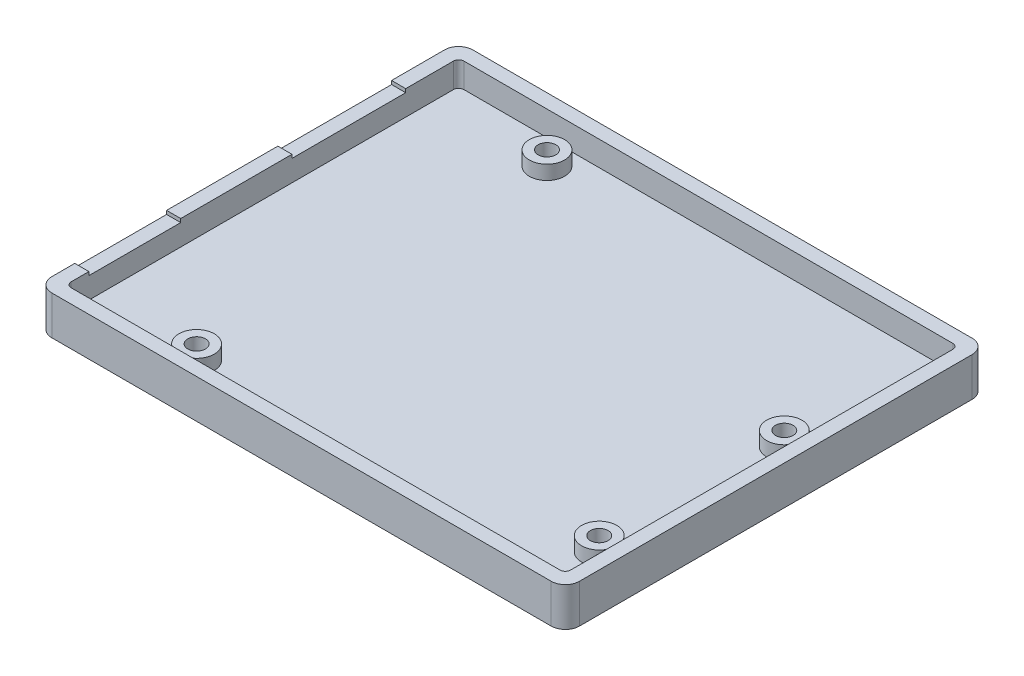
ISO-10303-21;
HEADER;
FILE_DESCRIPTION(('STEP AP214'),'2;1');
FILE_NAME('part.step','',(''),(''),'','','');
FILE_SCHEMA(('AUTOMOTIVE_DESIGN { 1 0 10303 214 1 1 1 1 }'));
ENDSEC;
DATA;
#1=APPLICATION_CONTEXT('core data for automotive mechanical design processes');
#2=APPLICATION_PROTOCOL_DEFINITION('international standard','automotive_design',2000,#1);
#3=PRODUCT_CONTEXT('',#1,'mechanical');
#4=PRODUCT('Part','Part','',(#3));
#5=PRODUCT_RELATED_PRODUCT_CATEGORY('part','',(#4));
#6=PRODUCT_DEFINITION_FORMATION('','',#4);
#7=PRODUCT_DEFINITION_CONTEXT('part definition',#1,'design');
#8=PRODUCT_DEFINITION('design','',#6,#7);
#9=PRODUCT_DEFINITION_SHAPE('','',#8);
#10=(LENGTH_UNIT() NAMED_UNIT(*) SI_UNIT(.MILLI.,.METRE.));
#11=(NAMED_UNIT(*) PLANE_ANGLE_UNIT() SI_UNIT($,.RADIAN.));
#12=(NAMED_UNIT(*) SI_UNIT($,.STERADIAN.) SOLID_ANGLE_UNIT());
#13=UNCERTAINTY_MEASURE_WITH_UNIT(LENGTH_MEASURE(1.E-05),#10,'distance_accuracy_value','');
#14=(GEOMETRIC_REPRESENTATION_CONTEXT(3) GLOBAL_UNCERTAINTY_ASSIGNED_CONTEXT((#13)) GLOBAL_UNIT_ASSIGNED_CONTEXT((#10,
#11,#12)) REPRESENTATION_CONTEXT('',''));
#15=CARTESIAN_POINT('',(0.,0.,0.));
#16=DIRECTION('',(0.,0.,1.));
#17=DIRECTION('',(1.,0.,0.));
#18=AXIS2_PLACEMENT_3D('',#15,#16,#17);
#19=CARTESIAN_POINT('',(0.,1.5,0.));
#20=DIRECTION('',(0.,1.,0.));
#21=DIRECTION('',(0.,0.,1.));
#22=AXIS2_PLACEMENT_3D('',#19,#20,#21);
#23=PLANE('',#22);
#24=DIRECTION('',(-1.,0.,0.));
#25=VECTOR('',#24,1.);
#26=CARTESIAN_POINT('',(-1.00000000000001,1.5,-15.2500000000277));
#27=LINE('',#26,#25);
#28=CARTESIAN_POINT('',(-1.00000000000001,1.5,-15.2500000000277));
#29=VERTEX_POINT('',#28);
#30=CARTESIAN_POINT('',(-3.,1.5,-15.2500000000277));
#31=VERTEX_POINT('',#30);
#32=EDGE_CURVE('E227',#29,#31,#27,.T.);
#33=ORIENTED_EDGE('',*,*,#32,.F.);
#34=DIRECTION('',(0.,0.,1.));
#35=VECTOR('',#34,1.);
#36=CARTESIAN_POINT('',(-0.999999999999993,1.5,0.));
#37=LINE('',#36,#35);
#38=CARTESIAN_POINT('',(-1.00000000000001,1.5,-31.0000000000155));
#39=VERTEX_POINT('',#38);
#40=EDGE_CURVE('E344',#39,#29,#37,.T.);
#41=ORIENTED_EDGE('',*,*,#40,.F.);
#42=DIRECTION('',(1.,0.,0.));
#43=VECTOR('',#42,1.);
#44=CARTESIAN_POINT('',(-3.00000000000001,1.5,-31.0000000000155));
#45=LINE('',#44,#43);
#46=CARTESIAN_POINT('',(-3.,1.5,-31.0000000000155));
#47=VERTEX_POINT('',#46);
#48=EDGE_CURVE('E251',#47,#39,#45,.T.);
#49=ORIENTED_EDGE('',*,*,#48,.F.);
#50=DIRECTION('',(0.,0.,1.));
#51=VECTOR('',#50,1.);
#52=CARTESIAN_POINT('',(-3.,1.5,0.));
#53=LINE('',#52,#51);
#54=EDGE_CURVE('E318',#47,#31,#53,.T.);
#55=ORIENTED_EDGE('',*,*,#54,.T.);
#56=EDGE_LOOP('',(#33,#41,#49,#55));
#57=FACE_BOUND('',#56,.T.);
#58=ADVANCED_FACE('F40',(#57),#23,.T.);
#59=CARTESIAN_POINT('',(71.7,-4.,-56.6));
#60=DIRECTION('',(0.,0.,-1.));
#61=DIRECTION('',(-1.,0.,0.));
#62=AXIS2_PLACEMENT_3D('',#59,#60,#61);
#63=PLANE('',#62);
#64=DIRECTION('',(-1.,0.,0.));
#65=VECTOR('',#64,1.);
#66=CARTESIAN_POINT('',(71.7,-4.,-56.6));
#67=LINE('',#66,#65);
#68=CARTESIAN_POINT('',(69.7,-4.,-56.6));
#69=VERTEX_POINT('',#68);
#70=CARTESIAN_POINT('',(-1.,-4.,-56.6));
#71=VERTEX_POINT('',#70);
#72=EDGE_CURVE('E343',#69,#71,#67,.T.);
#73=ORIENTED_EDGE('',*,*,#72,.T.);
#74=DIRECTION('',(0.,1.,0.));
#75=VECTOR('',#74,1.);
#76=CARTESIAN_POINT('',(-1.,-4.,-56.6));
#77=LINE('',#76,#75);
#78=CARTESIAN_POINT('',(-1.,1.5,-56.6));
#79=VERTEX_POINT('',#78);
#80=EDGE_CURVE('E403',#71,#79,#77,.T.);
#81=ORIENTED_EDGE('',*,*,#80,.T.);
#82=DIRECTION('',(-1.,0.,0.));
#83=VECTOR('',#82,1.);
#84=CARTESIAN_POINT('',(0.,1.5,-56.6));
#85=LINE('',#84,#83);
#86=CARTESIAN_POINT('',(69.7,1.5,-56.6));
#87=VERTEX_POINT('',#86);
#88=EDGE_CURVE('E317',#87,#79,#85,.T.);
#89=ORIENTED_EDGE('',*,*,#88,.F.);
#90=DIRECTION('',(0.,1.,0.));
#91=VECTOR('',#90,1.);
#92=CARTESIAN_POINT('',(69.7,-4.,-56.6));
#93=LINE('',#92,#91);
#94=EDGE_CURVE('E401',#87,#69,#93,.F.);
#95=ORIENTED_EDGE('',*,*,#94,.T.);
#96=EDGE_LOOP('',(#73,#81,#89,#95));
#97=FACE_BOUND('',#96,.T.);
#98=ADVANCED_FACE('F466',(#97),#63,.T.);
#99=CARTESIAN_POINT('',(71.7,-4.,3.));
#100=DIRECTION('',(1.,0.,0.));
#101=DIRECTION('',(0.,0.,-1.));
#102=AXIS2_PLACEMENT_3D('',#99,#100,#101);
#103=PLANE('',#102);
#104=DIRECTION('',(0.,0.,-1.));
#105=VECTOR('',#104,1.);
#106=CARTESIAN_POINT('',(71.7,1.5,0.));
#107=LINE('',#106,#105);
#108=CARTESIAN_POINT('',(71.7,1.5,1.));
#109=VERTEX_POINT('',#108);
#110=CARTESIAN_POINT('',(71.7,1.5,-54.6));
#111=VERTEX_POINT('',#110);
#112=EDGE_CURVE('E321',#109,#111,#107,.T.);
#113=ORIENTED_EDGE('',*,*,#112,.F.);
#114=DIRECTION('',(0.,1.,0.));
#115=VECTOR('',#114,1.);
#116=CARTESIAN_POINT('',(71.7,-4.,1.));
#117=LINE('',#116,#115);
#118=CARTESIAN_POINT('',(71.7,-4.,1.));
#119=VERTEX_POINT('',#118);
#120=EDGE_CURVE('E12',#109,#119,#117,.F.);
#121=ORIENTED_EDGE('',*,*,#120,.T.);
#122=DIRECTION('',(0.,0.,-1.));
#123=VECTOR('',#122,1.);
#124=CARTESIAN_POINT('',(71.7,-4.,3.));
#125=LINE('',#124,#123);
#126=CARTESIAN_POINT('',(71.7,-4.,-54.6));
#127=VERTEX_POINT('',#126);
#128=EDGE_CURVE('E353',#119,#127,#125,.T.);
#129=ORIENTED_EDGE('',*,*,#128,.T.);
#130=DIRECTION('',(0.,1.,0.));
#131=VECTOR('',#130,1.);
#132=CARTESIAN_POINT('',(71.7,-4.,-54.6));
#133=LINE('',#132,#131);
#134=EDGE_CURVE('E48',#127,#111,#133,.T.);
#135=ORIENTED_EDGE('',*,*,#134,.T.);
#136=EDGE_LOOP('',(#113,#121,#129,#135));
#137=FACE_BOUND('',#136,.T.);
#138=ADVANCED_FACE('F434',(#137),#103,.T.);
#139=CARTESIAN_POINT('',(-3.,-4.,3.));
#140=DIRECTION('',(0.,0.,1.));
#141=DIRECTION('',(1.,0.,0.));
#142=AXIS2_PLACEMENT_3D('',#139,#140,#141);
#143=PLANE('',#142);
#144=DIRECTION('',(1.,0.,0.));
#145=VECTOR('',#144,1.);
#146=CARTESIAN_POINT('',(-3.,-4.,3.));
#147=LINE('',#146,#145);
#148=CARTESIAN_POINT('',(-1.,-4.,3.));
#149=VERTEX_POINT('',#148);
#150=CARTESIAN_POINT('',(69.7,-4.,3.));
#151=VERTEX_POINT('',#150);
#152=EDGE_CURVE('E350',#149,#151,#147,.T.);
#153=ORIENTED_EDGE('',*,*,#152,.T.);
#154=DIRECTION('',(0.,1.,0.));
#155=VECTOR('',#154,1.);
#156=CARTESIAN_POINT('',(69.7,-4.,3.));
#157=LINE('',#156,#155);
#158=CARTESIAN_POINT('',(69.7,1.5,3.));
#159=VERTEX_POINT('',#158);
#160=EDGE_CURVE('E428',#151,#159,#157,.T.);
#161=ORIENTED_EDGE('',*,*,#160,.T.);
#162=DIRECTION('',(1.,0.,0.));
#163=VECTOR('',#162,1.);
#164=CARTESIAN_POINT('',(0.,1.5,3.));
#165=LINE('',#164,#163);
#166=CARTESIAN_POINT('',(-1.,1.5,3.));
#167=VERTEX_POINT('',#166);
#168=EDGE_CURVE('E324',#167,#159,#165,.T.);
#169=ORIENTED_EDGE('',*,*,#168,.F.);
#170=DIRECTION('',(0.,1.,0.));
#171=VECTOR('',#170,1.);
#172=CARTESIAN_POINT('',(-1.,-4.,3.));
#173=LINE('',#172,#171);
#174=EDGE_CURVE('E426',#167,#149,#173,.F.);
#175=ORIENTED_EDGE('',*,*,#174,.T.);
#176=EDGE_LOOP('',(#153,#161,#169,#175));
#177=FACE_BOUND('',#176,.T.);
#178=ADVANCED_FACE('F448',(#177),#143,.T.);
#179=CARTESIAN_POINT('',(-3.,-4.,-56.6));
#180=DIRECTION('',(-1.,0.,0.));
#181=DIRECTION('',(0.,0.,1.));
#182=AXIS2_PLACEMENT_3D('',#179,#180,#181);
#183=PLANE('',#182);
#184=DIRECTION('',(0.,1.,0.));
#185=VECTOR('',#184,1.);
#186=CARTESIAN_POINT('',(-3.,1.,-15.2500000000277));
#187=LINE('',#186,#185);
#188=CARTESIAN_POINT('',(-3.,1.,-15.2500000000277));
#189=VERTEX_POINT('',#188);
#190=EDGE_CURVE('E268',#189,#31,#187,.T.);
#191=ORIENTED_EDGE('',*,*,#190,.T.);
#192=ORIENTED_EDGE('',*,*,#54,.F.);
#193=DIRECTION('',(0.,1.,0.));
#194=VECTOR('',#193,1.);
#195=CARTESIAN_POINT('',(-3.00000000000001,1.,-31.0000000000155));
#196=LINE('',#195,#194);
#197=CARTESIAN_POINT('',(-3.00000000000001,1.,-31.0000000000155));
#198=VERTEX_POINT('',#197);
#199=EDGE_CURVE('E63',#198,#47,#196,.T.);
#200=ORIENTED_EDGE('',*,*,#199,.F.);
#201=DIRECTION('',(0.,0.,1.));
#202=VECTOR('',#201,1.);
#203=CARTESIAN_POINT('',(-3.00000000000001,1.,-47.0999999999908));
#204=LINE('',#203,#202);
#205=CARTESIAN_POINT('',(-3.00000000000001,1.,-47.0999999999908));
#206=VERTEX_POINT('',#205);
#207=EDGE_CURVE('E239',#206,#198,#204,.T.);
#208=ORIENTED_EDGE('',*,*,#207,.F.);
#209=DIRECTION('',(0.,1.,0.));
#210=VECTOR('',#209,1.);
#211=CARTESIAN_POINT('',(-3.00000000000001,1.,-47.0999999999908));
#212=LINE('',#211,#210);
#213=CARTESIAN_POINT('',(-3.00000000000001,1.5,-47.0999999999908));
#214=VERTEX_POINT('',#213);
#215=EDGE_CURVE('E254',#206,#214,#212,.T.);
#216=ORIENTED_EDGE('',*,*,#215,.T.);
#217=CARTESIAN_POINT('',(-3.,1.5,-54.6));
#218=VERTEX_POINT('',#217);
#219=EDGE_CURVE('E314',#218,#214,#53,.T.);
#220=ORIENTED_EDGE('',*,*,#219,.F.);
#221=DIRECTION('',(0.,1.,0.));
#222=VECTOR('',#221,1.);
#223=CARTESIAN_POINT('',(-3.,-4.,-54.6));
#224=LINE('',#223,#222);
#225=CARTESIAN_POINT('',(-3.,-4.,-54.6));
#226=VERTEX_POINT('',#225);
#227=EDGE_CURVE('E416',#218,#226,#224,.F.);
#228=ORIENTED_EDGE('',*,*,#227,.T.);
#229=DIRECTION('',(0.,0.,1.));
#230=VECTOR('',#229,1.);
#231=CARTESIAN_POINT('',(-3.,-4.,-56.6));
#232=LINE('',#231,#230);
#233=CARTESIAN_POINT('',(-3.,-4.,1.));
#234=VERTEX_POINT('',#233);
#235=EDGE_CURVE('E347',#226,#234,#232,.T.);
#236=ORIENTED_EDGE('',*,*,#235,.T.);
#237=DIRECTION('',(0.,1.,0.));
#238=VECTOR('',#237,1.);
#239=CARTESIAN_POINT('',(-3.,-4.,1.));
#240=LINE('',#239,#238);
#241=CARTESIAN_POINT('',(-3.,1.5,1.));
#242=VERTEX_POINT('',#241);
#243=EDGE_CURVE('E414',#234,#242,#240,.T.);
#244=ORIENTED_EDGE('',*,*,#243,.T.);
#245=CARTESIAN_POINT('',(-3.,1.5,-2.25000000001319));
#246=VERTEX_POINT('',#245);
#247=EDGE_CURVE('E232',#246,#242,#53,.T.);
#248=ORIENTED_EDGE('',*,*,#247,.F.);
#249=DIRECTION('',(0.,1.,0.));
#250=VECTOR('',#249,1.);
#251=CARTESIAN_POINT('',(-3.,1.,-2.25000000001319));
#252=LINE('',#251,#250);
#253=CARTESIAN_POINT('',(-3.,1.,-2.25000000001319));
#254=VERTEX_POINT('',#253);
#255=EDGE_CURVE('E55',#254,#246,#252,.T.);
#256=ORIENTED_EDGE('',*,*,#255,.F.);
#257=DIRECTION('',(0.,0.,1.));
#258=VECTOR('',#257,1.);
#259=CARTESIAN_POINT('',(-3.,1.,-15.2500000000277));
#260=LINE('',#259,#258);
#261=EDGE_CURVE('E218',#189,#254,#260,.T.);
#262=ORIENTED_EDGE('',*,*,#261,.F.);
#263=EDGE_LOOP('',(#191,#192,#200,#208,#216,#220,#228,#236,#244,#248,#256,#262));
#264=FACE_BOUND('',#263,.T.);
#265=ADVANCED_FACE('F230',(#264),#183,.T.);
#266=CARTESIAN_POINT('',(0.,-4.,0.));
#267=DIRECTION('',(0.,1.,0.));
#268=DIRECTION('',(0.,0.,1.));
#269=AXIS2_PLACEMENT_3D('',#266,#267,#268);
#270=PLANE('',#269);
#271=ORIENTED_EDGE('',*,*,#235,.F.);
#272=CARTESIAN_POINT('',(-1.,-4.,-54.6));
#273=DIRECTION('',(0.,1.,0.));
#274=DIRECTION('',(0.,0.,1.));
#275=AXIS2_PLACEMENT_3D('',#272,#273,#274);
#276=CIRCLE('',#275,2.);
#277=EDGE_CURVE('E424',#226,#71,#276,.F.);
#278=ORIENTED_EDGE('',*,*,#277,.T.);
#279=ORIENTED_EDGE('',*,*,#72,.F.);
#280=CARTESIAN_POINT('',(69.7,-4.,-54.6));
#281=DIRECTION('',(0.,1.,0.));
#282=DIRECTION('',(0.,0.,1.));
#283=AXIS2_PLACEMENT_3D('',#280,#281,#282);
#284=CIRCLE('',#283,2.);
#285=EDGE_CURVE('E420',#69,#127,#284,.F.);
#286=ORIENTED_EDGE('',*,*,#285,.T.);
#287=ORIENTED_EDGE('',*,*,#128,.F.);
#288=CARTESIAN_POINT('',(69.7,-4.,1.));
#289=DIRECTION('',(0.,1.,0.));
#290=DIRECTION('',(0.,0.,1.));
#291=AXIS2_PLACEMENT_3D('',#288,#289,#290);
#292=CIRCLE('',#291,2.);
#293=EDGE_CURVE('E422',#119,#151,#292,.F.);
#294=ORIENTED_EDGE('',*,*,#293,.T.);
#295=ORIENTED_EDGE('',*,*,#152,.F.);
#296=CARTESIAN_POINT('',(-1.,-4.,1.));
#297=DIRECTION('',(0.,1.,0.));
#298=DIRECTION('',(0.,0.,1.));
#299=AXIS2_PLACEMENT_3D('',#296,#297,#298);
#300=CIRCLE('',#299,2.);
#301=EDGE_CURVE('E418',#149,#234,#300,.F.);
#302=ORIENTED_EDGE('',*,*,#301,.T.);
#303=EDGE_LOOP('',(#271,#278,#279,#286,#287,#294,#295,#302));
#304=FACE_BOUND('',#303,.T.);
#305=ADVANCED_FACE('F454',(#304),#270,.F.);
#306=CARTESIAN_POINT('',(-0.999999999999993,98.5628065724317,0.));
#307=DIRECTION('',(1.,0.,0.));
#308=DIRECTION('',(0.,0.,-1.));
#309=AXIS2_PLACEMENT_3D('',#306,#307,#308);
#310=PLANE('',#309);
#311=DIRECTION('',(0.,1.,0.));
#312=VECTOR('',#311,1.);
#313=CARTESIAN_POINT('',(-1.00000000000001,1.,-15.2500000000277));
#314=LINE('',#313,#312);
#315=CARTESIAN_POINT('',(-1.00000000000001,1.,-15.2500000000277));
#316=VERTEX_POINT('',#315);
#317=EDGE_CURVE('E234',#316,#29,#314,.T.);
#318=ORIENTED_EDGE('',*,*,#317,.F.);
#319=DIRECTION('',(0.,0.,-1.));
#320=VECTOR('',#319,1.);
#321=CARTESIAN_POINT('',(-1.00000000000001,1.,-2.25000000001319));
#322=LINE('',#321,#320);
#323=CARTESIAN_POINT('',(-1.00000000000001,1.,-2.25000000001319));
#324=VERTEX_POINT('',#323);
#325=EDGE_CURVE('E217',#324,#316,#322,.T.);
#326=ORIENTED_EDGE('',*,*,#325,.F.);
#327=DIRECTION('',(0.,1.,0.));
#328=VECTOR('',#327,1.);
#329=CARTESIAN_POINT('',(-1.00000000000001,1.,-2.25000000001319));
#330=LINE('',#329,#328);
#331=CARTESIAN_POINT('',(-1.00000000000001,1.5,-2.25000000001319));
#332=VERTEX_POINT('',#331);
#333=EDGE_CURVE('E214',#324,#332,#330,.T.);
#334=ORIENTED_EDGE('',*,*,#333,.T.);
#335=CARTESIAN_POINT('',(-0.999999999999993,1.5,0.25));
#336=VERTEX_POINT('',#335);
#337=EDGE_CURVE('E339',#332,#336,#37,.T.);
#338=ORIENTED_EDGE('',*,*,#337,.T.);
#339=DIRECTION('',(0.,-1.,0.));
#340=VECTOR('',#339,1.);
#341=CARTESIAN_POINT('',(-0.999999999999993,-2.,0.25));
#342=LINE('',#341,#340);
#343=CARTESIAN_POINT('',(-0.999999999999993,-2.,0.25));
#344=VERTEX_POINT('',#343);
#345=EDGE_CURVE('E377',#336,#344,#342,.T.);
#346=ORIENTED_EDGE('',*,*,#345,.T.);
#347=DIRECTION('',(0.,0.,1.));
#348=VECTOR('',#347,1.);
#349=CARTESIAN_POINT('',(-0.999999999999993,-2.,0.));
#350=LINE('',#349,#348);
#351=CARTESIAN_POINT('',(-1.,-2.,-53.85));
#352=VERTEX_POINT('',#351);
#353=EDGE_CURVE('E336',#352,#344,#350,.T.);
#354=ORIENTED_EDGE('',*,*,#353,.F.);
#355=DIRECTION('',(0.,-1.,0.));
#356=VECTOR('',#355,1.);
#357=CARTESIAN_POINT('',(-1.,1.5,-53.85));
#358=LINE('',#357,#356);
#359=CARTESIAN_POINT('',(-1.,1.5,-53.85));
#360=VERTEX_POINT('',#359);
#361=EDGE_CURVE('E380',#352,#360,#358,.F.);
#362=ORIENTED_EDGE('',*,*,#361,.T.);
#363=CARTESIAN_POINT('',(-1.00000000000001,1.5,-47.0999999999908));
#364=VERTEX_POINT('',#363);
#365=EDGE_CURVE('E340',#360,#364,#37,.T.);
#366=ORIENTED_EDGE('',*,*,#365,.T.);
#367=DIRECTION('',(0.,1.,0.));
#368=VECTOR('',#367,1.);
#369=CARTESIAN_POINT('',(-1.00000000000001,1.,-47.0999999999908));
#370=LINE('',#369,#368);
#371=CARTESIAN_POINT('',(-1.00000000000001,1.,-47.0999999999908));
#372=VERTEX_POINT('',#371);
#373=EDGE_CURVE('E258',#372,#364,#370,.T.);
#374=ORIENTED_EDGE('',*,*,#373,.F.);
#375=DIRECTION('',(0.,0.,-1.));
#376=VECTOR('',#375,1.);
#377=CARTESIAN_POINT('',(-1.00000000000001,1.,-31.0000000000155));
#378=LINE('',#377,#376);
#379=CARTESIAN_POINT('',(-1.00000000000001,1.,-31.0000000000155));
#380=VERTEX_POINT('',#379);
#381=EDGE_CURVE('E246',#380,#372,#378,.T.);
#382=ORIENTED_EDGE('',*,*,#381,.F.);
#383=DIRECTION('',(0.,1.,0.));
#384=VECTOR('',#383,1.);
#385=CARTESIAN_POINT('',(-1.00000000000001,1.,-31.0000000000155));
#386=LINE('',#385,#384);
#387=EDGE_CURVE('E260',#380,#39,#386,.T.);
#388=ORIENTED_EDGE('',*,*,#387,.T.);
#389=ORIENTED_EDGE('',*,*,#40,.T.);
#390=EDGE_LOOP('',(#318,#326,#334,#338,#346,#354,#362,#366,#374,#382,#388,#389));
#391=FACE_BOUND('',#390,.T.);
#392=ADVANCED_FACE('F479',(#391),#310,.T.);
#393=CARTESIAN_POINT('',(0.,98.5628065724317,-54.6));
#394=DIRECTION('',(0.,0.,1.));
#395=DIRECTION('',(1.,0.,0.));
#396=AXIS2_PLACEMENT_3D('',#393,#394,#395);
#397=PLANE('',#396);
#398=DIRECTION('',(-1.,0.,0.));
#399=VECTOR('',#398,1.);
#400=CARTESIAN_POINT('',(0.,1.5,-54.6));
#401=LINE('',#400,#399);
#402=CARTESIAN_POINT('',(68.95,1.5,-54.6));
#403=VERTEX_POINT('',#402);
#404=CARTESIAN_POINT('',(-0.25,1.5,-54.6));
#405=VERTEX_POINT('',#404);
#406=EDGE_CURVE('E305',#403,#405,#401,.T.);
#407=ORIENTED_EDGE('',*,*,#406,.T.);
#408=DIRECTION('',(0.,-1.,0.));
#409=VECTOR('',#408,1.);
#410=CARTESIAN_POINT('',(-0.25,-2.,-54.6));
#411=LINE('',#410,#409);
#412=CARTESIAN_POINT('',(-0.25,-2.,-54.6));
#413=VERTEX_POINT('',#412);
#414=EDGE_CURVE('E366',#405,#413,#411,.T.);
#415=ORIENTED_EDGE('',*,*,#414,.T.);
#416=DIRECTION('',(-1.,0.,0.));
#417=VECTOR('',#416,1.);
#418=CARTESIAN_POINT('',(0.,-2.,-54.6));
#419=LINE('',#418,#417);
#420=CARTESIAN_POINT('',(68.95,-2.,-54.6));
#421=VERTEX_POINT('',#420);
#422=EDGE_CURVE('E333',#421,#413,#419,.T.);
#423=ORIENTED_EDGE('',*,*,#422,.F.);
#424=DIRECTION('',(0.,-1.,0.));
#425=VECTOR('',#424,1.);
#426=CARTESIAN_POINT('',(68.95,1.5,-54.6));
#427=LINE('',#426,#425);
#428=EDGE_CURVE('E356',#421,#403,#427,.F.);
#429=ORIENTED_EDGE('',*,*,#428,.T.);
#430=EDGE_LOOP('',(#407,#415,#423,#429));
#431=FACE_BOUND('',#430,.T.);
#432=ADVANCED_FACE('F491',(#431),#397,.T.);
#433=CARTESIAN_POINT('',(69.7,98.5628065724317,0.));
#434=DIRECTION('',(-1.,0.,0.));
#435=DIRECTION('',(0.,0.,1.));
#436=AXIS2_PLACEMENT_3D('',#433,#434,#435);
#437=PLANE('',#436);
#438=DIRECTION('',(0.,0.,-1.));
#439=VECTOR('',#438,1.);
#440=CARTESIAN_POINT('',(69.7,1.5,0.));
#441=LINE('',#440,#439);
#442=CARTESIAN_POINT('',(69.7,1.5,0.249999999999996));
#443=VERTEX_POINT('',#442);
#444=CARTESIAN_POINT('',(69.7,1.5,-53.85));
#445=VERTEX_POINT('',#444);
#446=EDGE_CURVE('E308',#443,#445,#441,.T.);
#447=ORIENTED_EDGE('',*,*,#446,.T.);
#448=DIRECTION('',(0.,-1.,0.));
#449=VECTOR('',#448,1.);
#450=CARTESIAN_POINT('',(69.7,-2.,-53.85));
#451=LINE('',#450,#449);
#452=CARTESIAN_POINT('',(69.7,-2.,-53.85));
#453=VERTEX_POINT('',#452);
#454=EDGE_CURVE('E384',#445,#453,#451,.T.);
#455=ORIENTED_EDGE('',*,*,#454,.T.);
#456=DIRECTION('',(0.,0.,-1.));
#457=VECTOR('',#456,1.);
#458=CARTESIAN_POINT('',(69.7,-2.,0.));
#459=LINE('',#458,#457);
#460=CARTESIAN_POINT('',(69.7,-2.,0.249999999999996));
#461=VERTEX_POINT('',#460);
#462=EDGE_CURVE('E330',#461,#453,#459,.T.);
#463=ORIENTED_EDGE('',*,*,#462,.F.);
#464=DIRECTION('',(0.,-1.,0.));
#465=VECTOR('',#464,1.);
#466=CARTESIAN_POINT('',(69.7,1.5,0.249999999999996));
#467=LINE('',#466,#465);
#468=EDGE_CURVE('E382',#461,#443,#467,.F.);
#469=ORIENTED_EDGE('',*,*,#468,.T.);
#470=EDGE_LOOP('',(#447,#455,#463,#469));
#471=FACE_BOUND('',#470,.T.);
#472=ADVANCED_FACE('F502',(#471),#437,.T.);
#473=CARTESIAN_POINT('',(0.,98.5628065724317,1.));
#474=DIRECTION('',(0.,0.,-1.));
#475=DIRECTION('',(-1.,0.,0.));
#476=AXIS2_PLACEMENT_3D('',#473,#474,#475);
#477=PLANE('',#476);
#478=DIRECTION('',(1.,0.,0.));
#479=VECTOR('',#478,1.);
#480=CARTESIAN_POINT('',(0.,-2.,1.));
#481=LINE('',#480,#479);
#482=CARTESIAN_POINT('',(-0.249999999999993,-2.,1.));
#483=VERTEX_POINT('',#482);
#484=CARTESIAN_POINT('',(68.95,-2.,0.999999999999995));
#485=VERTEX_POINT('',#484);
#486=EDGE_CURVE('E327',#483,#485,#481,.T.);
#487=ORIENTED_EDGE('',*,*,#486,.F.);
#488=DIRECTION('',(0.,-1.,0.));
#489=VECTOR('',#488,1.);
#490=CARTESIAN_POINT('',(-0.249999999999993,1.5,1.));
#491=LINE('',#490,#489);
#492=CARTESIAN_POINT('',(-0.249999999999993,1.5,1.));
#493=VERTEX_POINT('',#492);
#494=EDGE_CURVE('E390',#483,#493,#491,.F.);
#495=ORIENTED_EDGE('',*,*,#494,.T.);
#496=DIRECTION('',(1.,0.,0.));
#497=VECTOR('',#496,1.);
#498=CARTESIAN_POINT('',(0.,1.5,1.));
#499=LINE('',#498,#497);
#500=CARTESIAN_POINT('',(68.95,1.5,0.999999999999995));
#501=VERTEX_POINT('',#500);
#502=EDGE_CURVE('E311',#493,#501,#499,.T.);
#503=ORIENTED_EDGE('',*,*,#502,.T.);
#504=DIRECTION('',(0.,-1.,0.));
#505=VECTOR('',#504,1.);
#506=CARTESIAN_POINT('',(68.95,-2.,0.999999999999996));
#507=LINE('',#506,#505);
#508=EDGE_CURVE('E387',#501,#485,#507,.T.);
#509=ORIENTED_EDGE('',*,*,#508,.T.);
#510=EDGE_LOOP('',(#487,#495,#503,#509));
#511=FACE_BOUND('',#510,.T.);
#512=ADVANCED_FACE('F512',(#511),#477,.T.);
#513=DIRECTION('',(1.,0.,0.));
#514=VECTOR('',#513,1.);
#515=CARTESIAN_POINT('',(-3.,1.5,-2.25000000001319));
#516=LINE('',#515,#514);
#517=EDGE_CURVE('E257',#246,#332,#516,.T.);
#518=ORIENTED_EDGE('',*,*,#517,.F.);
#519=ORIENTED_EDGE('',*,*,#247,.T.);
#520=CARTESIAN_POINT('',(-1.,1.5,1.));
#521=DIRECTION('',(0.,1.,0.));
#522=DIRECTION('',(0.,0.,1.));
#523=AXIS2_PLACEMENT_3D('',#520,#521,#522);
#524=CIRCLE('',#523,2.);
#525=EDGE_CURVE('E406',#242,#167,#524,.T.);
#526=ORIENTED_EDGE('',*,*,#525,.T.);
#527=ORIENTED_EDGE('',*,*,#168,.T.);
#528=CARTESIAN_POINT('',(69.7,1.5,1.));
#529=DIRECTION('',(0.,1.,0.));
#530=DIRECTION('',(0.,0.,1.));
#531=AXIS2_PLACEMENT_3D('',#528,#529,#530);
#532=CIRCLE('',#531,2.);
#533=EDGE_CURVE('E410',#159,#109,#532,.T.);
#534=ORIENTED_EDGE('',*,*,#533,.T.);
#535=ORIENTED_EDGE('',*,*,#112,.T.);
#536=CARTESIAN_POINT('',(69.7,1.5,-54.6));
#537=DIRECTION('',(0.,1.,0.));
#538=DIRECTION('',(0.,0.,1.));
#539=AXIS2_PLACEMENT_3D('',#536,#537,#538);
#540=CIRCLE('',#539,2.);
#541=EDGE_CURVE('E408',#111,#87,#540,.T.);
#542=ORIENTED_EDGE('',*,*,#541,.T.);
#543=ORIENTED_EDGE('',*,*,#88,.T.);
#544=CARTESIAN_POINT('',(-1.,1.5,-54.6));
#545=DIRECTION('',(0.,1.,0.));
#546=DIRECTION('',(0.,0.,1.));
#547=AXIS2_PLACEMENT_3D('',#544,#545,#546);
#548=CIRCLE('',#547,2.);
#549=EDGE_CURVE('E412',#79,#218,#548,.T.);
#550=ORIENTED_EDGE('',*,*,#549,.T.);
#551=ORIENTED_EDGE('',*,*,#219,.T.);
#552=DIRECTION('',(-1.,0.,0.));
#553=VECTOR('',#552,1.);
#554=CARTESIAN_POINT('',(-1.00000000000001,1.5,-47.0999999999908));
#555=LINE('',#554,#553);
#556=EDGE_CURVE('E243',#364,#214,#555,.T.);
#557=ORIENTED_EDGE('',*,*,#556,.F.);
#558=ORIENTED_EDGE('',*,*,#365,.F.);
#559=CARTESIAN_POINT('',(-0.25,1.5,-53.85));
#560=DIRECTION('',(0.,1.,0.));
#561=DIRECTION('',(0.,0.,1.));
#562=AXIS2_PLACEMENT_3D('',#559,#560,#561);
#563=CIRCLE('',#562,0.75);
#564=EDGE_CURVE('E392',#360,#405,#563,.F.);
#565=ORIENTED_EDGE('',*,*,#564,.T.);
#566=ORIENTED_EDGE('',*,*,#406,.F.);
#567=CARTESIAN_POINT('',(68.95,1.5,-53.85));
#568=DIRECTION('',(0.,1.,0.));
#569=DIRECTION('',(0.,0.,1.));
#570=AXIS2_PLACEMENT_3D('',#567,#568,#569);
#571=CIRCLE('',#570,0.75);
#572=EDGE_CURVE('E394',#403,#445,#571,.F.);
#573=ORIENTED_EDGE('',*,*,#572,.T.);
#574=ORIENTED_EDGE('',*,*,#446,.F.);
#575=CARTESIAN_POINT('',(68.95,1.5,0.249999999999996));
#576=DIRECTION('',(0.,1.,0.));
#577=DIRECTION('',(0.,0.,1.));
#578=AXIS2_PLACEMENT_3D('',#575,#576,#577);
#579=CIRCLE('',#578,0.75);
#580=EDGE_CURVE('E399',#443,#501,#579,.F.);
#581=ORIENTED_EDGE('',*,*,#580,.T.);
#582=ORIENTED_EDGE('',*,*,#502,.F.);
#583=CARTESIAN_POINT('',(-0.249999999999993,1.5,0.25));
#584=DIRECTION('',(0.,1.,0.));
#585=DIRECTION('',(0.,0.,1.));
#586=AXIS2_PLACEMENT_3D('',#583,#584,#585);
#587=CIRCLE('',#586,0.75);
#588=EDGE_CURVE('E396',#493,#336,#587,.F.);
#589=ORIENTED_EDGE('',*,*,#588,.T.);
#590=ORIENTED_EDGE('',*,*,#337,.F.);
#591=EDGE_LOOP('',(#518,#519,#526,#527,#534,#535,#542,#543,#550,#551,#557,#558,#565,#566,#573,
#574,#581,#582,#589,#590));
#592=FACE_BOUND('',#591,.T.);
#593=ADVANCED_FACE('F440',(#592),#23,.T.);
#594=CARTESIAN_POINT('',(0.,-2.,0.));
#595=DIRECTION('',(0.,1.,0.));
#596=DIRECTION('',(0.,0.,1.));
#597=AXIS2_PLACEMENT_3D('',#594,#595,#596);
#598=PLANE('',#597);
#599=CARTESIAN_POINT('',(66.,-2.,-7.5));
#600=DIRECTION('',(0.,1.,0.));
#601=DIRECTION('',(0.,0.,1.));
#602=AXIS2_PLACEMENT_3D('',#599,#600,#601);
#603=CIRCLE('',#602,2.5);
#604=CARTESIAN_POINT('',(66.,-2.,-5.));
#605=VERTEX_POINT('',#604);
#606=EDGE_CURVE('E292',#605,#605,#603,.F.);
#607=ORIENTED_EDGE('',*,*,#606,.T.);
#608=EDGE_LOOP('',(#607));
#609=FACE_BOUND('',#608,.T.);
#610=CARTESIAN_POINT('',(66.2,-2.,-33.5));
#611=DIRECTION('',(0.,1.,0.));
#612=DIRECTION('',(0.,0.,1.));
#613=AXIS2_PLACEMENT_3D('',#610,#611,#612);
#614=CIRCLE('',#613,2.50000000000001);
#615=CARTESIAN_POINT('',(66.2,-2.,-31.));
#616=VERTEX_POINT('',#615);
#617=EDGE_CURVE('E296',#616,#616,#614,.F.);
#618=ORIENTED_EDGE('',*,*,#617,.T.);
#619=EDGE_LOOP('',(#618));
#620=FACE_BOUND('',#619,.T.);
#621=CARTESIAN_POINT('',(15.,-2.,-51.1));
#622=DIRECTION('',(0.,1.,0.));
#623=DIRECTION('',(0.,0.,1.));
#624=AXIS2_PLACEMENT_3D('',#621,#622,#623);
#625=CIRCLE('',#624,2.5);
#626=CARTESIAN_POINT('',(15.,-2.,-48.6));
#627=VERTEX_POINT('',#626);
#628=EDGE_CURVE('E300',#627,#627,#625,.F.);
#629=ORIENTED_EDGE('',*,*,#628,.T.);
#630=EDGE_LOOP('',(#629));
#631=FACE_BOUND('',#630,.T.);
#632=CARTESIAN_POINT('',(14.,-2.,-2.5));
#633=DIRECTION('',(0.,1.,0.));
#634=DIRECTION('',(0.,0.,1.));
#635=AXIS2_PLACEMENT_3D('',#632,#633,#634);
#636=CIRCLE('',#635,2.5);
#637=CARTESIAN_POINT('',(14.,-2.,0.));
#638=VERTEX_POINT('',#637);
#639=EDGE_CURVE('E304',#638,#638,#636,.F.);
#640=ORIENTED_EDGE('',*,*,#639,.T.);
#641=EDGE_LOOP('',(#640));
#642=FACE_BOUND('',#641,.T.);
#643=ORIENTED_EDGE('',*,*,#422,.T.);
#644=CARTESIAN_POINT('',(-0.25,-2.,-53.85));
#645=DIRECTION('',(0.,1.,0.));
#646=DIRECTION('',(0.,0.,1.));
#647=AXIS2_PLACEMENT_3D('',#644,#645,#646);
#648=CIRCLE('',#647,0.75);
#649=EDGE_CURVE('E375',#413,#352,#648,.T.);
#650=ORIENTED_EDGE('',*,*,#649,.T.);
#651=ORIENTED_EDGE('',*,*,#353,.T.);
#652=CARTESIAN_POINT('',(-0.249999999999993,-2.,0.25));
#653=DIRECTION('',(0.,1.,0.));
#654=DIRECTION('',(0.,0.,1.));
#655=AXIS2_PLACEMENT_3D('',#652,#653,#654);
#656=CIRCLE('',#655,0.75);
#657=EDGE_CURVE('E371',#344,#483,#656,.T.);
#658=ORIENTED_EDGE('',*,*,#657,.T.);
#659=ORIENTED_EDGE('',*,*,#486,.T.);
#660=CARTESIAN_POINT('',(68.95,-2.,0.249999999999996));
#661=DIRECTION('',(0.,1.,0.));
#662=DIRECTION('',(0.,0.,1.));
#663=AXIS2_PLACEMENT_3D('',#660,#661,#662);
#664=CIRCLE('',#663,0.75);
#665=EDGE_CURVE('E369',#485,#461,#664,.T.);
#666=ORIENTED_EDGE('',*,*,#665,.T.);
#667=ORIENTED_EDGE('',*,*,#462,.T.);
#668=CARTESIAN_POINT('',(68.95,-2.,-53.85));
#669=DIRECTION('',(0.,1.,0.));
#670=DIRECTION('',(0.,0.,1.));
#671=AXIS2_PLACEMENT_3D('',#668,#669,#670);
#672=CIRCLE('',#671,0.75);
#673=EDGE_CURVE('E373',#453,#421,#672,.T.);
#674=ORIENTED_EDGE('',*,*,#673,.T.);
#675=EDGE_LOOP('',(#643,#650,#651,#658,#659,#666,#667,#674));
#676=FACE_BOUND('',#675,.T.);
#677=ADVANCED_FACE('F494',(#609,#620,#631,#642,#676),#598,.T.);
#678=CARTESIAN_POINT('',(14.,7.07106781186551,-2.5));
#679=DIRECTION('',(0.,-1.,0.));
#680=DIRECTION('',(0.,0.,-1.));
#681=AXIS2_PLACEMENT_3D('',#678,#679,#680);
#682=CYLINDRICAL_SURFACE('',#681,2.5);
#683=ORIENTED_EDGE('',*,*,#639,.F.);
#684=EDGE_LOOP('',(#683));
#685=FACE_BOUND('',#684,.T.);
#686=CARTESIAN_POINT('',(14.,0.,-2.5));
#687=DIRECTION('',(0.,1.,0.));
#688=DIRECTION('',(0.,0.,1.));
#689=AXIS2_PLACEMENT_3D('',#686,#687,#688);
#690=CIRCLE('',#689,2.5);
#691=CARTESIAN_POINT('',(14.,0.,0.));
#692=VERTEX_POINT('',#691);
#693=EDGE_CURVE('E301',#692,#692,#690,.T.);
#694=ORIENTED_EDGE('',*,*,#693,.F.);
#695=EDGE_LOOP('',(#694));
#696=FACE_BOUND('',#695,.T.);
#697=ADVANCED_FACE('F554',(#685,#696),#682,.T.);
#698=CARTESIAN_POINT('',(0.,0.,0.));
#699=DIRECTION('',(0.,1.,0.));
#700=DIRECTION('',(0.,0.,1.));
#701=AXIS2_PLACEMENT_3D('',#698,#699,#700);
#702=PLANE('',#701);
#703=CARTESIAN_POINT('',(14.,0.,-2.5));
#704=DIRECTION('',(0.,1.,0.));
#705=DIRECTION('',(0.,0.,1.));
#706=AXIS2_PLACEMENT_3D('',#703,#704,#705);
#707=CIRCLE('',#706,1.25);
#708=CARTESIAN_POINT('',(14.,0.,-1.25));
#709=VERTEX_POINT('',#708);
#710=EDGE_CURVE('E283',#709,#709,#707,.T.);
#711=ORIENTED_EDGE('',*,*,#710,.F.);
#712=EDGE_LOOP('',(#711));
#713=FACE_BOUND('',#712,.T.);
#714=ORIENTED_EDGE('',*,*,#693,.T.);
#715=EDGE_LOOP('',(#714));
#716=FACE_BOUND('',#715,.T.);
#717=ADVANCED_FACE('F648',(#713,#716),#702,.T.);
#718=CARTESIAN_POINT('',(15.,7.07106781186551,-51.1));
#719=DIRECTION('',(0.,-1.,0.));
#720=DIRECTION('',(0.,0.,-1.));
#721=AXIS2_PLACEMENT_3D('',#718,#719,#720);
#722=CYLINDRICAL_SURFACE('',#721,2.5);
#723=ORIENTED_EDGE('',*,*,#628,.F.);
#724=EDGE_LOOP('',(#723));
#725=FACE_BOUND('',#724,.T.);
#726=CARTESIAN_POINT('',(15.,0.,-51.1));
#727=DIRECTION('',(0.,1.,0.));
#728=DIRECTION('',(0.,0.,1.));
#729=AXIS2_PLACEMENT_3D('',#726,#727,#728);
#730=CIRCLE('',#729,2.5);
#731=CARTESIAN_POINT('',(15.,0.,-48.6));
#732=VERTEX_POINT('',#731);
#733=EDGE_CURVE('E297',#732,#732,#730,.T.);
#734=ORIENTED_EDGE('',*,*,#733,.F.);
#735=EDGE_LOOP('',(#734));
#736=FACE_BOUND('',#735,.T.);
#737=ADVANCED_FACE('F645',(#725,#736),#722,.T.);
#738=CARTESIAN_POINT('',(0.,0.,0.));
#739=DIRECTION('',(0.,1.,0.));
#740=DIRECTION('',(0.,0.,1.));
#741=AXIS2_PLACEMENT_3D('',#738,#739,#740);
#742=PLANE('',#741);
#743=CARTESIAN_POINT('',(15.,0.,-51.1));
#744=DIRECTION('',(0.,1.,0.));
#745=DIRECTION('',(0.,0.,1.));
#746=AXIS2_PLACEMENT_3D('',#743,#744,#745);
#747=CIRCLE('',#746,1.25);
#748=CARTESIAN_POINT('',(15.,0.,-49.85));
#749=VERTEX_POINT('',#748);
#750=EDGE_CURVE('E277',#749,#749,#747,.T.);
#751=ORIENTED_EDGE('',*,*,#750,.F.);
#752=EDGE_LOOP('',(#751));
#753=FACE_BOUND('',#752,.T.);
#754=ORIENTED_EDGE('',*,*,#733,.T.);
#755=EDGE_LOOP('',(#754));
#756=FACE_BOUND('',#755,.T.);
#757=ADVANCED_FACE('F640',(#753,#756),#742,.T.);
#758=CARTESIAN_POINT('',(66.2,7.07106781186551,-33.5));
#759=DIRECTION('',(0.,-1.,0.));
#760=DIRECTION('',(0.,0.,-1.));
#761=AXIS2_PLACEMENT_3D('',#758,#759,#760);
#762=CYLINDRICAL_SURFACE('',#761,2.50000000000001);
#763=ORIENTED_EDGE('',*,*,#617,.F.);
#764=EDGE_LOOP('',(#763));
#765=FACE_BOUND('',#764,.T.);
#766=CARTESIAN_POINT('',(66.2,0.,-33.5));
#767=DIRECTION('',(0.,1.,0.));
#768=DIRECTION('',(0.,0.,1.));
#769=AXIS2_PLACEMENT_3D('',#766,#767,#768);
#770=CIRCLE('',#769,2.50000000000001);
#771=CARTESIAN_POINT('',(66.2,0.,-31.));
#772=VERTEX_POINT('',#771);
#773=EDGE_CURVE('E293',#772,#772,#770,.T.);
#774=ORIENTED_EDGE('',*,*,#773,.F.);
#775=EDGE_LOOP('',(#774));
#776=FACE_BOUND('',#775,.T.);
#777=ADVANCED_FACE('F637',(#765,#776),#762,.T.);
#778=CARTESIAN_POINT('',(0.,0.,0.));
#779=DIRECTION('',(0.,1.,0.));
#780=DIRECTION('',(0.,0.,1.));
#781=AXIS2_PLACEMENT_3D('',#778,#779,#780);
#782=PLANE('',#781);
#783=CARTESIAN_POINT('',(66.2,0.,-33.5));
#784=DIRECTION('',(0.,1.,0.));
#785=DIRECTION('',(0.,0.,1.));
#786=AXIS2_PLACEMENT_3D('',#783,#784,#785);
#787=CIRCLE('',#786,1.25);
#788=CARTESIAN_POINT('',(66.2,0.,-32.25));
#789=VERTEX_POINT('',#788);
#790=EDGE_CURVE('E271',#789,#789,#787,.T.);
#791=ORIENTED_EDGE('',*,*,#790,.F.);
#792=EDGE_LOOP('',(#791));
#793=FACE_BOUND('',#792,.T.);
#794=ORIENTED_EDGE('',*,*,#773,.T.);
#795=EDGE_LOOP('',(#794));
#796=FACE_BOUND('',#795,.T.);
#797=ADVANCED_FACE('F632',(#793,#796),#782,.T.);
#798=CARTESIAN_POINT('',(66.,7.07106781186551,-7.5));
#799=DIRECTION('',(0.,-1.,0.));
#800=DIRECTION('',(0.,0.,-1.));
#801=AXIS2_PLACEMENT_3D('',#798,#799,#800);
#802=CYLINDRICAL_SURFACE('',#801,2.5);
#803=ORIENTED_EDGE('',*,*,#606,.F.);
#804=EDGE_LOOP('',(#803));
#805=FACE_BOUND('',#804,.T.);
#806=CARTESIAN_POINT('',(66.,0.,-7.5));
#807=DIRECTION('',(0.,1.,0.));
#808=DIRECTION('',(0.,0.,1.));
#809=AXIS2_PLACEMENT_3D('',#806,#807,#808);
#810=CIRCLE('',#809,2.5);
#811=CARTESIAN_POINT('',(66.,0.,-5.));
#812=VERTEX_POINT('',#811);
#813=EDGE_CURVE('E289',#812,#812,#810,.T.);
#814=ORIENTED_EDGE('',*,*,#813,.F.);
#815=EDGE_LOOP('',(#814));
#816=FACE_BOUND('',#815,.T.);
#817=ADVANCED_FACE('F629',(#805,#816),#802,.T.);
#818=CARTESIAN_POINT('',(0.,0.,0.));
#819=DIRECTION('',(0.,1.,0.));
#820=DIRECTION('',(0.,0.,1.));
#821=AXIS2_PLACEMENT_3D('',#818,#819,#820);
#822=PLANE('',#821);
#823=CARTESIAN_POINT('',(66.,0.,-7.5));
#824=DIRECTION('',(0.,1.,0.));
#825=DIRECTION('',(0.,0.,1.));
#826=AXIS2_PLACEMENT_3D('',#823,#824,#825);
#827=CIRCLE('',#826,1.25);
#828=CARTESIAN_POINT('',(66.,0.,-6.25));
#829=VERTEX_POINT('',#828);
#830=EDGE_CURVE('E264',#829,#829,#827,.T.);
#831=ORIENTED_EDGE('',*,*,#830,.F.);
#832=EDGE_LOOP('',(#831));
#833=FACE_BOUND('',#832,.T.);
#834=ORIENTED_EDGE('',*,*,#813,.T.);
#835=EDGE_LOOP('',(#834));
#836=FACE_BOUND('',#835,.T.);
#837=ADVANCED_FACE('F627',(#833,#836),#822,.T.);
#838=CARTESIAN_POINT('',(14.,-2.5,-2.5));
#839=DIRECTION('',(0.,1.,0.));
#840=DIRECTION('',(0.,0.,1.));
#841=AXIS2_PLACEMENT_3D('',#838,#839,#840);
#842=CONICAL_SURFACE('',#841,1.25,1.02974425867665);
#843=CARTESIAN_POINT('',(14.,-3.25107577378445,-2.5));
#844=VERTEX_POINT('',#843);
#845=VERTEX_LOOP('',#844);
#846=FACE_BOUND('',#845,.T.);
#847=CARTESIAN_POINT('',(14.,-2.5,-2.5));
#848=DIRECTION('',(0.,1.,0.));
#849=DIRECTION('',(0.,0.,1.));
#850=AXIS2_PLACEMENT_3D('',#847,#848,#849);
#851=CIRCLE('',#850,1.25);
#852=CARTESIAN_POINT('',(14.,-2.5,-1.25));
#853=VERTEX_POINT('',#852);
#854=EDGE_CURVE('E286',#853,#853,#851,.T.);
#855=ORIENTED_EDGE('',*,*,#854,.T.);
#856=EDGE_LOOP('',(#855));
#857=FACE_BOUND('',#856,.T.);
#858=ADVANCED_FACE('F623',(#846,#857),#842,.F.);
#859=CARTESIAN_POINT('',(14.,0.,-2.5));
#860=DIRECTION('',(0.,1.,0.));
#861=DIRECTION('',(0.,0.,1.));
#862=AXIS2_PLACEMENT_3D('',#859,#860,#861);
#863=CYLINDRICAL_SURFACE('',#862,1.25);
#864=ORIENTED_EDGE('',*,*,#854,.F.);
#865=EDGE_LOOP('',(#864));
#866=FACE_BOUND('',#865,.T.);
#867=ORIENTED_EDGE('',*,*,#710,.T.);
#868=EDGE_LOOP('',(#867));
#869=FACE_BOUND('',#868,.T.);
#870=ADVANCED_FACE('F619',(#866,#869),#863,.F.);
#871=CARTESIAN_POINT('',(15.,-2.5,-51.1));
#872=DIRECTION('',(0.,1.,0.));
#873=DIRECTION('',(0.,0.,1.));
#874=AXIS2_PLACEMENT_3D('',#871,#872,#873);
#875=CONICAL_SURFACE('',#874,1.25,1.02974425867665);
#876=CARTESIAN_POINT('',(15.,-3.25107577378445,-51.1));
#877=VERTEX_POINT('',#876);
#878=VERTEX_LOOP('',#877);
#879=FACE_BOUND('',#878,.T.);
#880=CARTESIAN_POINT('',(15.,-2.5,-51.1));
#881=DIRECTION('',(0.,1.,0.));
#882=DIRECTION('',(0.,0.,1.));
#883=AXIS2_PLACEMENT_3D('',#880,#881,#882);
#884=CIRCLE('',#883,1.25);
#885=CARTESIAN_POINT('',(15.,-2.5,-49.85));
#886=VERTEX_POINT('',#885);
#887=EDGE_CURVE('E280',#886,#886,#884,.T.);
#888=ORIENTED_EDGE('',*,*,#887,.T.);
#889=EDGE_LOOP('',(#888));
#890=FACE_BOUND('',#889,.T.);
#891=ADVANCED_FACE('F615',(#879,#890),#875,.F.);
#892=CARTESIAN_POINT('',(15.,0.,-51.1));
#893=DIRECTION('',(0.,1.,0.));
#894=DIRECTION('',(0.,0.,1.));
#895=AXIS2_PLACEMENT_3D('',#892,#893,#894);
#896=CYLINDRICAL_SURFACE('',#895,1.25);
#897=ORIENTED_EDGE('',*,*,#887,.F.);
#898=EDGE_LOOP('',(#897));
#899=FACE_BOUND('',#898,.T.);
#900=ORIENTED_EDGE('',*,*,#750,.T.);
#901=EDGE_LOOP('',(#900));
#902=FACE_BOUND('',#901,.T.);
#903=ADVANCED_FACE('F611',(#899,#902),#896,.F.);
#904=CARTESIAN_POINT('',(66.2,-2.5,-33.5));
#905=DIRECTION('',(0.,1.,0.));
#906=DIRECTION('',(0.,0.,1.));
#907=AXIS2_PLACEMENT_3D('',#904,#905,#906);
#908=CONICAL_SURFACE('',#907,1.25,1.02974425867666);
#909=CARTESIAN_POINT('',(66.2,-3.25107577378445,-33.5));
#910=VERTEX_POINT('',#909);
#911=VERTEX_LOOP('',#910);
#912=FACE_BOUND('',#911,.T.);
#913=CARTESIAN_POINT('',(66.2,-2.5,-33.5));
#914=DIRECTION('',(0.,1.,0.));
#915=DIRECTION('',(0.,0.,1.));
#916=AXIS2_PLACEMENT_3D('',#913,#914,#915);
#917=CIRCLE('',#916,1.25);
#918=CARTESIAN_POINT('',(66.2,-2.5,-32.25));
#919=VERTEX_POINT('',#918);
#920=EDGE_CURVE('E274',#919,#919,#917,.T.);
#921=ORIENTED_EDGE('',*,*,#920,.T.);
#922=EDGE_LOOP('',(#921));
#923=FACE_BOUND('',#922,.T.);
#924=ADVANCED_FACE('F607',(#912,#923),#908,.F.);
#925=CARTESIAN_POINT('',(66.2,0.,-33.5));
#926=DIRECTION('',(0.,1.,0.));
#927=DIRECTION('',(0.,0.,1.));
#928=AXIS2_PLACEMENT_3D('',#925,#926,#927);
#929=CYLINDRICAL_SURFACE('',#928,1.25);
#930=ORIENTED_EDGE('',*,*,#920,.F.);
#931=EDGE_LOOP('',(#930));
#932=FACE_BOUND('',#931,.T.);
#933=ORIENTED_EDGE('',*,*,#790,.T.);
#934=EDGE_LOOP('',(#933));
#935=FACE_BOUND('',#934,.T.);
#936=ADVANCED_FACE('F603',(#932,#935),#929,.F.);
#937=CARTESIAN_POINT('',(66.,-2.5,-7.5));
#938=DIRECTION('',(0.,1.,0.));
#939=DIRECTION('',(0.,0.,1.));
#940=AXIS2_PLACEMENT_3D('',#937,#938,#939);
#941=CONICAL_SURFACE('',#940,1.25,1.02974425867666);
#942=CARTESIAN_POINT('',(66.,-3.25107577378445,-7.5));
#943=VERTEX_POINT('',#942);
#944=VERTEX_LOOP('',#943);
#945=FACE_BOUND('',#944,.T.);
#946=CARTESIAN_POINT('',(66.,-2.5,-7.5));
#947=DIRECTION('',(0.,1.,0.));
#948=DIRECTION('',(0.,0.,1.));
#949=AXIS2_PLACEMENT_3D('',#946,#947,#948);
#950=CIRCLE('',#949,1.25);
#951=CARTESIAN_POINT('',(66.,-2.5,-6.25));
#952=VERTEX_POINT('',#951);
#953=EDGE_CURVE('E267',#952,#952,#950,.T.);
#954=ORIENTED_EDGE('',*,*,#953,.T.);
#955=EDGE_LOOP('',(#954));
#956=FACE_BOUND('',#955,.T.);
#957=ADVANCED_FACE('F599',(#945,#956),#941,.F.);
#958=CARTESIAN_POINT('',(66.,0.,-7.5));
#959=DIRECTION('',(0.,1.,0.));
#960=DIRECTION('',(0.,0.,1.));
#961=AXIS2_PLACEMENT_3D('',#958,#959,#960);
#962=CYLINDRICAL_SURFACE('',#961,1.25);
#963=ORIENTED_EDGE('',*,*,#953,.F.);
#964=EDGE_LOOP('',(#963));
#965=FACE_BOUND('',#964,.T.);
#966=ORIENTED_EDGE('',*,*,#830,.T.);
#967=EDGE_LOOP('',(#966));
#968=FACE_BOUND('',#967,.T.);
#969=ADVANCED_FACE('F574',(#965,#968),#962,.F.);
#970=CARTESIAN_POINT('',(-0.25,98.5628065724317,-53.85));
#971=DIRECTION('',(0.,1.,0.));
#972=DIRECTION('',(0.,0.,1.));
#973=AXIS2_PLACEMENT_3D('',#970,#971,#972);
#974=CYLINDRICAL_SURFACE('',#973,0.75);
#975=ORIENTED_EDGE('',*,*,#564,.F.);
#976=ORIENTED_EDGE('',*,*,#361,.F.);
#977=ORIENTED_EDGE('',*,*,#649,.F.);
#978=ORIENTED_EDGE('',*,*,#414,.F.);
#979=EDGE_LOOP('',(#975,#976,#977,#978));
#980=FACE_BOUND('',#979,.T.);
#981=ADVANCED_FACE('F488',(#980),#974,.F.);
#982=CARTESIAN_POINT('',(68.95,98.5628065724317,-53.85));
#983=DIRECTION('',(0.,1.,0.));
#984=DIRECTION('',(0.,0.,1.));
#985=AXIS2_PLACEMENT_3D('',#982,#983,#984);
#986=CYLINDRICAL_SURFACE('',#985,0.75);
#987=ORIENTED_EDGE('',*,*,#572,.F.);
#988=ORIENTED_EDGE('',*,*,#428,.F.);
#989=ORIENTED_EDGE('',*,*,#673,.F.);
#990=ORIENTED_EDGE('',*,*,#454,.F.);
#991=EDGE_LOOP('',(#987,#988,#989,#990));
#992=FACE_BOUND('',#991,.T.);
#993=ADVANCED_FACE('F500',(#992),#986,.F.);
#994=CARTESIAN_POINT('',(-0.249999999999993,98.5628065724317,0.25));
#995=DIRECTION('',(0.,1.,0.));
#996=DIRECTION('',(0.,0.,1.));
#997=AXIS2_PLACEMENT_3D('',#994,#995,#996);
#998=CYLINDRICAL_SURFACE('',#997,0.75);
#999=ORIENTED_EDGE('',*,*,#588,.F.);
#1000=ORIENTED_EDGE('',*,*,#494,.F.);
#1001=ORIENTED_EDGE('',*,*,#657,.F.);
#1002=ORIENTED_EDGE('',*,*,#345,.F.);
#1003=EDGE_LOOP('',(#999,#1000,#1001,#1002));
#1004=FACE_BOUND('',#1003,.T.);
#1005=ADVANCED_FACE('F517',(#1004),#998,.F.);
#1006=CARTESIAN_POINT('',(68.95,98.5628065724317,0.249999999999996));
#1007=DIRECTION('',(0.,1.,0.));
#1008=DIRECTION('',(0.,0.,1.));
#1009=AXIS2_PLACEMENT_3D('',#1006,#1007,#1008);
#1010=CYLINDRICAL_SURFACE('',#1009,0.75);
#1011=ORIENTED_EDGE('',*,*,#580,.F.);
#1012=ORIENTED_EDGE('',*,*,#468,.F.);
#1013=ORIENTED_EDGE('',*,*,#665,.F.);
#1014=ORIENTED_EDGE('',*,*,#508,.F.);
#1015=EDGE_LOOP('',(#1011,#1012,#1013,#1014));
#1016=FACE_BOUND('',#1015,.T.);
#1017=ADVANCED_FACE('F509',(#1016),#1010,.F.);
#1018=CARTESIAN_POINT('',(-1.,-4.,-54.6));
#1019=DIRECTION('',(0.,1.,0.));
#1020=DIRECTION('',(0.,0.,1.));
#1021=AXIS2_PLACEMENT_3D('',#1018,#1019,#1020);
#1022=CYLINDRICAL_SURFACE('',#1021,2.);
#1023=ORIENTED_EDGE('',*,*,#277,.F.);
#1024=ORIENTED_EDGE('',*,*,#227,.F.);
#1025=ORIENTED_EDGE('',*,*,#549,.F.);
#1026=ORIENTED_EDGE('',*,*,#80,.F.);
#1027=EDGE_LOOP('',(#1023,#1024,#1025,#1026));
#1028=FACE_BOUND('',#1027,.T.);
#1029=ADVANCED_FACE('F464',(#1028),#1022,.T.);
#1030=CARTESIAN_POINT('',(69.7,-4.,1.));
#1031=DIRECTION('',(0.,1.,0.));
#1032=DIRECTION('',(0.,0.,1.));
#1033=AXIS2_PLACEMENT_3D('',#1030,#1031,#1032);
#1034=CYLINDRICAL_SURFACE('',#1033,2.);
#1035=ORIENTED_EDGE('',*,*,#293,.F.);
#1036=ORIENTED_EDGE('',*,*,#120,.F.);
#1037=ORIENTED_EDGE('',*,*,#533,.F.);
#1038=ORIENTED_EDGE('',*,*,#160,.F.);
#1039=EDGE_LOOP('',(#1035,#1036,#1037,#1038));
#1040=FACE_BOUND('',#1039,.T.);
#1041=ADVANCED_FACE('F446',(#1040),#1034,.T.);
#1042=CARTESIAN_POINT('',(69.7,-4.,-54.6));
#1043=DIRECTION('',(0.,1.,0.));
#1044=DIRECTION('',(0.,0.,1.));
#1045=AXIS2_PLACEMENT_3D('',#1042,#1043,#1044);
#1046=CYLINDRICAL_SURFACE('',#1045,2.);
#1047=ORIENTED_EDGE('',*,*,#285,.F.);
#1048=ORIENTED_EDGE('',*,*,#94,.F.);
#1049=ORIENTED_EDGE('',*,*,#541,.F.);
#1050=ORIENTED_EDGE('',*,*,#134,.F.);
#1051=EDGE_LOOP('',(#1047,#1048,#1049,#1050));
#1052=FACE_BOUND('',#1051,.T.);
#1053=ADVANCED_FACE('F584',(#1052),#1046,.T.);
#1054=CARTESIAN_POINT('',(-1.,-4.,1.));
#1055=DIRECTION('',(0.,1.,0.));
#1056=DIRECTION('',(0.,0.,1.));
#1057=AXIS2_PLACEMENT_3D('',#1054,#1055,#1056);
#1058=CYLINDRICAL_SURFACE('',#1057,2.);
#1059=ORIENTED_EDGE('',*,*,#301,.F.);
#1060=ORIENTED_EDGE('',*,*,#174,.F.);
#1061=ORIENTED_EDGE('',*,*,#525,.F.);
#1062=ORIENTED_EDGE('',*,*,#243,.F.);
#1063=EDGE_LOOP('',(#1059,#1060,#1061,#1062));
#1064=FACE_BOUND('',#1063,.T.);
#1065=ADVANCED_FACE('F42',(#1064),#1058,.T.);
#1066=CARTESIAN_POINT('',(-1.00000000000001,1.,-47.0999999999908));
#1067=DIRECTION('',(0.,0.,-1.));
#1068=DIRECTION('',(-1.,0.,0.));
#1069=AXIS2_PLACEMENT_3D('',#1066,#1067,#1068);
#1070=PLANE('',#1069);
#1071=ORIENTED_EDGE('',*,*,#556,.T.);
#1072=ORIENTED_EDGE('',*,*,#215,.F.);
#1073=DIRECTION('',(-1.,0.,0.));
#1074=VECTOR('',#1073,1.);
#1075=CARTESIAN_POINT('',(-1.00000000000001,1.,-47.0999999999908));
#1076=LINE('',#1075,#1074);
#1077=EDGE_CURVE('E248',#372,#206,#1076,.T.);
#1078=ORIENTED_EDGE('',*,*,#1077,.F.);
#1079=ORIENTED_EDGE('',*,*,#373,.T.);
#1080=EDGE_LOOP('',(#1071,#1072,#1078,#1079));
#1081=FACE_BOUND('',#1080,.T.);
#1082=ADVANCED_FACE('F472',(#1081),#1070,.F.);
#1083=CARTESIAN_POINT('',(-3.00000000000001,1.,-31.0000000000155));
#1084=DIRECTION('',(0.,0.,1.));
#1085=DIRECTION('',(1.,0.,0.));
#1086=AXIS2_PLACEMENT_3D('',#1083,#1084,#1085);
#1087=PLANE('',#1086);
#1088=ORIENTED_EDGE('',*,*,#48,.T.);
#1089=ORIENTED_EDGE('',*,*,#387,.F.);
#1090=DIRECTION('',(1.,0.,0.));
#1091=VECTOR('',#1090,1.);
#1092=CARTESIAN_POINT('',(-3.00000000000001,1.,-31.0000000000155));
#1093=LINE('',#1092,#1091);
#1094=EDGE_CURVE('E242',#198,#380,#1093,.T.);
#1095=ORIENTED_EDGE('',*,*,#1094,.F.);
#1096=ORIENTED_EDGE('',*,*,#199,.T.);
#1097=EDGE_LOOP('',(#1088,#1089,#1095,#1096));
#1098=FACE_BOUND('',#1097,.T.);
#1099=ADVANCED_FACE('F535',(#1098),#1087,.F.);
#1100=CARTESIAN_POINT('',(0.,1.,0.));
#1101=DIRECTION('',(0.,1.,0.));
#1102=DIRECTION('',(0.,0.,1.));
#1103=AXIS2_PLACEMENT_3D('',#1100,#1101,#1102);
#1104=PLANE('',#1103);
#1105=ORIENTED_EDGE('',*,*,#207,.T.);
#1106=ORIENTED_EDGE('',*,*,#1094,.T.);
#1107=ORIENTED_EDGE('',*,*,#381,.T.);
#1108=ORIENTED_EDGE('',*,*,#1077,.T.);
#1109=EDGE_LOOP('',(#1105,#1106,#1107,#1108));
#1110=FACE_BOUND('',#1109,.T.);
#1111=ADVANCED_FACE('F475',(#1110),#1104,.T.);
#1112=CARTESIAN_POINT('',(-1.00000000000001,1.,-15.2500000000277));
#1113=DIRECTION('',(0.,0.,-1.));
#1114=DIRECTION('',(-1.,0.,0.));
#1115=AXIS2_PLACEMENT_3D('',#1112,#1113,#1114);
#1116=PLANE('',#1115);
#1117=ORIENTED_EDGE('',*,*,#32,.T.);
#1118=ORIENTED_EDGE('',*,*,#190,.F.);
#1119=DIRECTION('',(-1.,0.,0.));
#1120=VECTOR('',#1119,1.);
#1121=CARTESIAN_POINT('',(-1.00000000000001,1.,-15.2500000000277));
#1122=LINE('',#1121,#1120);
#1123=EDGE_CURVE('E224',#316,#189,#1122,.T.);
#1124=ORIENTED_EDGE('',*,*,#1123,.F.);
#1125=ORIENTED_EDGE('',*,*,#317,.T.);
#1126=EDGE_LOOP('',(#1117,#1118,#1124,#1125));
#1127=FACE_BOUND('',#1126,.T.);
#1128=ADVANCED_FACE('F527',(#1127),#1116,.F.);
#1129=CARTESIAN_POINT('',(-3.,1.,-2.25000000001319));
#1130=DIRECTION('',(0.,0.,1.));
#1131=DIRECTION('',(1.,0.,0.));
#1132=AXIS2_PLACEMENT_3D('',#1129,#1130,#1131);
#1133=PLANE('',#1132);
#1134=ORIENTED_EDGE('',*,*,#517,.T.);
#1135=ORIENTED_EDGE('',*,*,#333,.F.);
#1136=DIRECTION('',(1.,0.,0.));
#1137=VECTOR('',#1136,1.);
#1138=CARTESIAN_POINT('',(-3.,1.,-2.25000000001319));
#1139=LINE('',#1138,#1137);
#1140=EDGE_CURVE('E210',#254,#324,#1139,.T.);
#1141=ORIENTED_EDGE('',*,*,#1140,.F.);
#1142=ORIENTED_EDGE('',*,*,#255,.T.);
#1143=EDGE_LOOP('',(#1134,#1135,#1141,#1142));
#1144=FACE_BOUND('',#1143,.T.);
#1145=ADVANCED_FACE('F212',(#1144),#1133,.F.);
#1146=CARTESIAN_POINT('',(0.,1.,0.));
#1147=DIRECTION('',(0.,1.,0.));
#1148=DIRECTION('',(0.,0.,1.));
#1149=AXIS2_PLACEMENT_3D('',#1146,#1147,#1148);
#1150=PLANE('',#1149);
#1151=ORIENTED_EDGE('',*,*,#261,.T.);
#1152=ORIENTED_EDGE('',*,*,#1140,.T.);
#1153=ORIENTED_EDGE('',*,*,#325,.T.);
#1154=ORIENTED_EDGE('',*,*,#1123,.T.);
#1155=EDGE_LOOP('',(#1151,#1152,#1153,#1154));
#1156=FACE_BOUND('',#1155,.T.);
#1157=ADVANCED_FACE('F222',(#1156),#1150,.T.);
#1158=CLOSED_SHELL('',(#58,#98,#138,#178,#265,#305,#392,#432,#472,#512,#593,#677,#697,#717,#737,
#757,#777,#797,#817,#837,#858,#870,#891,#903,#924,#936,#957,#969,#981,#993,#1005,#1017,#1029,
#1041,#1053,#1065,#1082,#1099,#1111,#1128,#1145,#1157));
#1159=MANIFOLD_SOLID_BREP('B2',#1158);
#1160=ADVANCED_BREP_SHAPE_REPRESENTATION('',(#18,#1159),#14);
#1161=SHAPE_DEFINITION_REPRESENTATION(#9,#1160);
ENDSEC;
END-ISO-10303-21;
